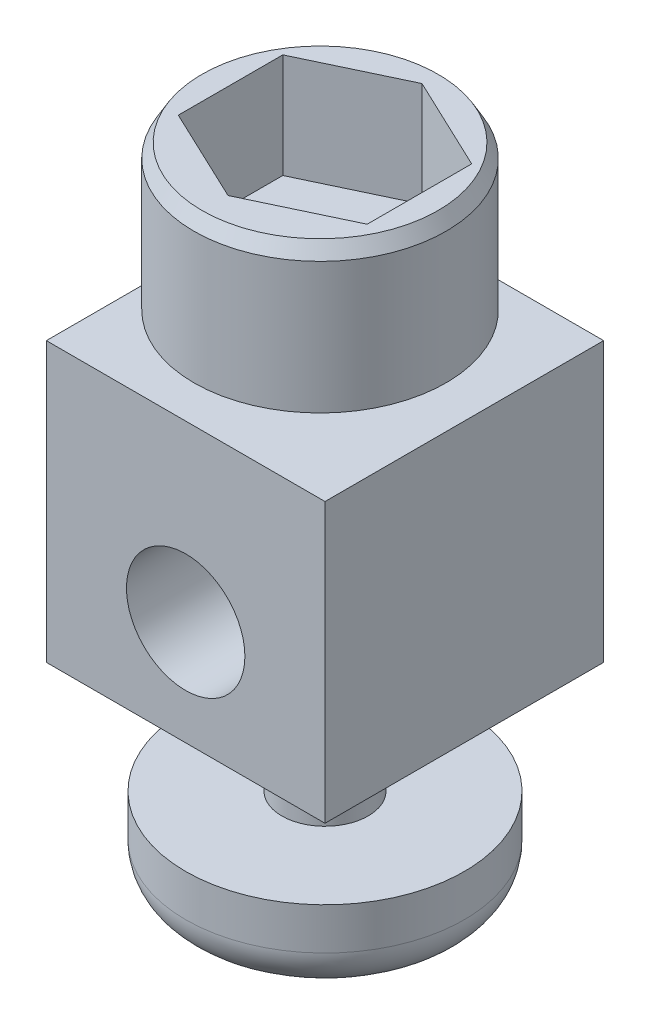
ISO-10303-21;
HEADER;
FILE_DESCRIPTION(('STEP AP214'),'2;1');
FILE_NAME('part.step','',(''),(''),'','','');
FILE_SCHEMA(('AUTOMOTIVE_DESIGN { 1 0 10303 214 1 1 1 1 }'));
ENDSEC;
DATA;
#1=APPLICATION_CONTEXT('core data for automotive mechanical design processes');
#2=APPLICATION_PROTOCOL_DEFINITION('international standard','automotive_design',2000,#1);
#3=PRODUCT_CONTEXT('',#1,'mechanical');
#4=PRODUCT('Part','Part','',(#3));
#5=PRODUCT_RELATED_PRODUCT_CATEGORY('part','',(#4));
#6=PRODUCT_DEFINITION_FORMATION('','',#4);
#7=PRODUCT_DEFINITION_CONTEXT('part definition',#1,'design');
#8=PRODUCT_DEFINITION('design','',#6,#7);
#9=PRODUCT_DEFINITION_SHAPE('','',#8);
#10=(LENGTH_UNIT() NAMED_UNIT(*) SI_UNIT(.MILLI.,.METRE.));
#11=(NAMED_UNIT(*) PLANE_ANGLE_UNIT() SI_UNIT($,.RADIAN.));
#12=(NAMED_UNIT(*) SI_UNIT($,.STERADIAN.) SOLID_ANGLE_UNIT());
#13=UNCERTAINTY_MEASURE_WITH_UNIT(LENGTH_MEASURE(1.E-05),#10,'distance_accuracy_value','');
#14=(GEOMETRIC_REPRESENTATION_CONTEXT(3) GLOBAL_UNCERTAINTY_ASSIGNED_CONTEXT((#13)) GLOBAL_UNIT_ASSIGNED_CONTEXT((#10,
#11,#12)) REPRESENTATION_CONTEXT('',''));
#15=CARTESIAN_POINT('',(0.,0.,0.));
#16=DIRECTION('',(0.,0.,1.));
#17=DIRECTION('',(1.,0.,0.));
#18=AXIS2_PLACEMENT_3D('',#15,#16,#17);
#19=CARTESIAN_POINT('',(0.,-6.5532,2.54));
#20=DIRECTION('',(0.,1.,0.));
#21=DIRECTION('',(-1.,0.,0.));
#22=AXIS2_PLACEMENT_3D('',#19,#20,#21);
#23=CYLINDRICAL_SURFACE('',#22,0.7874);
#24=CARTESIAN_POINT('',(0.,-4.57142455943335,2.54));
#25=DIRECTION('',(0.,1.,0.));
#26=DIRECTION('',(0.,0.,1.));
#27=AXIS2_PLACEMENT_3D('',#24,#25,#26);
#28=CIRCLE('',#27,0.7874);
#29=CARTESIAN_POINT('',(0.,-4.57142455943335,3.3274));
#30=VERTEX_POINT('',#29);
#31=EDGE_CURVE('E39',#30,#30,#28,.T.);
#32=ORIENTED_EDGE('',*,*,#31,.T.);
#33=EDGE_LOOP('',(#32));
#34=FACE_BOUND('',#33,.T.);
#35=CARTESIAN_POINT('',(0.,-2.54,2.54));
#36=DIRECTION('',(0.,1.,0.));
#37=DIRECTION('',(-1.,0.,0.));
#38=AXIS2_PLACEMENT_3D('',#35,#36,#37);
#39=CIRCLE('',#38,0.7874);
#40=CARTESIAN_POINT('',(-0.7874,-2.54,2.54));
#41=VERTEX_POINT('',#40);
#42=EDGE_CURVE('E183',#41,#41,#39,.F.);
#43=ORIENTED_EDGE('',*,*,#42,.T.);
#44=EDGE_LOOP('',(#43));
#45=FACE_BOUND('',#44,.T.);
#46=ADVANCED_FACE('F35',(#34,#45),#23,.T.);
#47=CARTESIAN_POINT('',(0.,5.715,2.63019473081329));
#48=DIRECTION('',(0.,1.,0.));
#49=DIRECTION('',(0.,0.,1.));
#50=AXIS2_PLACEMENT_3D('',#47,#48,#49);
#51=PLANE('',#50);
#52=CARTESIAN_POINT('',(0.,5.715,2.63019473081329));
#53=DIRECTION('',(0.,1.,0.));
#54=DIRECTION('',(0.,0.,1.));
#55=AXIS2_PLACEMENT_3D('',#52,#53,#54);
#56=CIRCLE('',#55,2.15205303162583);
#57=CARTESIAN_POINT('',(0.,5.715,4.78224776243912));
#58=VERTEX_POINT('',#57);
#59=EDGE_CURVE('E192',#58,#58,#56,.T.);
#60=ORIENTED_EDGE('',*,*,#59,.T.);
#61=EDGE_LOOP('',(#60));
#62=FACE_BOUND('',#61,.T.);
#63=DIRECTION('',(-0.00014525916845939,0.,0.999999989449887));
#64=VECTOR('',#63,1.);
#65=CARTESIAN_POINT('',(-1.72148007027149,5.715,1.58779210005618));
#66=LINE('',#65,#64);
#67=CARTESIAN_POINT('',(-1.72148007027149,5.715,1.58779210005618));
#68=VERTEX_POINT('',#67);
#69=CARTESIAN_POINT('',(-1.7217567889874,5.715,3.49279207995818));
#70=VERTEX_POINT('',#69);
#71=EDGE_CURVE('E140',#68,#70,#66,.T.);
#72=ORIENTED_EDGE('',*,*,#71,.F.);
#73=DIRECTION('',(0.90366407888267,0.,-0.428242025655045));
#74=VECTOR('',#73,1.);
#75=CARTESIAN_POINT('',(-1.72148007027149,5.715,1.58779210005618));
#76=LINE('',#75,#74);
#77=CARTESIAN_POINT('',(0.,5.715,0.771991041183319));
#78=VERTEX_POINT('',#77);
#79=EDGE_CURVE('E52',#68,#78,#76,.T.);
#80=ORIENTED_EDGE('',*,*,#79,.T.);
#81=DIRECTION('',(0.903736726890933,0.,0.428088692292221));
#82=VECTOR('',#81,1.);
#83=CARTESIAN_POINT('',(0.,5.715,0.771991041183319));
#84=LINE('',#83,#82);
#85=CARTESIAN_POINT('',(1.72161846472723,5.715,1.5875));
#86=VERTEX_POINT('',#85);
#87=EDGE_CURVE('E144',#78,#86,#84,.T.);
#88=ORIENTED_EDGE('',*,*,#87,.T.);
#89=DIRECTION('',(0.,0.,1.));
#90=VECTOR('',#89,1.);
#91=CARTESIAN_POINT('',(1.72161846472723,5.715,1.5875));
#92=LINE('',#91,#90);
#93=CARTESIAN_POINT('',(1.72161846472723,5.715,3.4925));
#94=VERTEX_POINT('',#93);
#95=EDGE_CURVE('E225',#86,#94,#92,.T.);
#96=ORIENTED_EDGE('',*,*,#95,.T.);
#97=DIRECTION('',(0.903736726890933,0.,-0.428088692292221));
#98=VECTOR('',#97,1.);
#99=CARTESIAN_POINT('',(0.,5.715,4.30800895881668));
#100=LINE('',#99,#98);
#101=CARTESIAN_POINT('',(0.,5.715,4.30800895881668));
#102=VERTEX_POINT('',#101);
#103=EDGE_CURVE('E228',#102,#94,#100,.T.);
#104=ORIENTED_EDGE('',*,*,#103,.F.);
#105=DIRECTION('',(0.903809338051129,0.,0.427935369479527));
#106=VECTOR('',#105,1.);
#107=CARTESIAN_POINT('',(-1.7217567889874,5.715,3.49279207995818));
#108=LINE('',#107,#106);
#109=EDGE_CURVE('E231',#70,#102,#108,.T.);
#110=ORIENTED_EDGE('',*,*,#109,.F.);
#111=EDGE_LOOP('',(#72,#80,#88,#96,#104,#110));
#112=FACE_BOUND('',#111,.T.);
#113=ADVANCED_FACE('F251',(#62,#112),#51,.T.);
#114=CARTESIAN_POINT('',(0.,5.715,2.63019473081329));
#115=DIRECTION('',(0.,-1.,0.));
#116=DIRECTION('',(0.,0.,-1.));
#117=AXIS2_PLACEMENT_3D('',#114,#115,#116);
#118=CYLINDRICAL_SURFACE('',#117,1.3716);
#119=CARTESIAN_POINT('',(0.,2.54,2.63019473081329));
#120=DIRECTION('',(0.,-1.,0.));
#121=DIRECTION('',(0.,0.,-1.));
#122=AXIS2_PLACEMENT_3D('',#119,#120,#121);
#123=CIRCLE('',#122,1.3716);
#124=CARTESIAN_POINT('',(0.,2.54,1.25859473081329));
#125=VERTEX_POINT('',#124);
#126=EDGE_CURVE('E186',#125,#125,#123,.F.);
#127=ORIENTED_EDGE('',*,*,#126,.T.);
#128=EDGE_LOOP('',(#127));
#129=FACE_BOUND('',#128,.T.);
#130=CARTESIAN_POINT('',(0.,2.921,2.63019473081329));
#131=DIRECTION('',(0.,1.,0.));
#132=DIRECTION('',(0.,0.,1.));
#133=AXIS2_PLACEMENT_3D('',#130,#131,#132);
#134=CIRCLE('',#133,1.3716);
#135=CARTESIAN_POINT('',(0.,2.921,4.00179473081329));
#136=VERTEX_POINT('',#135);
#137=EDGE_CURVE('E189',#136,#136,#134,.T.);
#138=ORIENTED_EDGE('',*,*,#137,.F.);
#139=EDGE_LOOP('',(#138));
#140=FACE_BOUND('',#139,.T.);
#141=ADVANCED_FACE('F272',(#129,#140),#118,.T.);
#142=CARTESIAN_POINT('',(2.54,2.54,5.08));
#143=DIRECTION('',(0.,-1.,0.));
#144=DIRECTION('',(0.,0.,-1.));
#145=AXIS2_PLACEMENT_3D('',#142,#143,#144);
#146=PLANE('',#145);
#147=DIRECTION('',(-1.,0.,0.));
#148=VECTOR('',#147,1.);
#149=CARTESIAN_POINT('',(2.54,2.54,0.));
#150=LINE('',#149,#148);
#151=CARTESIAN_POINT('',(2.54,2.54,0.));
#152=VERTEX_POINT('',#151);
#153=CARTESIAN_POINT('',(-2.54,2.54,0.));
#154=VERTEX_POINT('',#153);
#155=EDGE_CURVE('E172',#152,#154,#150,.T.);
#156=ORIENTED_EDGE('',*,*,#155,.T.);
#157=DIRECTION('',(0.,0.,-1.));
#158=VECTOR('',#157,1.);
#159=CARTESIAN_POINT('',(-2.54,2.54,5.08));
#160=LINE('',#159,#158);
#161=CARTESIAN_POINT('',(-2.54,2.54,5.08));
#162=VERTEX_POINT('',#161);
#163=EDGE_CURVE('E176',#162,#154,#160,.T.);
#164=ORIENTED_EDGE('',*,*,#163,.F.);
#165=DIRECTION('',(-1.,0.,0.));
#166=VECTOR('',#165,1.);
#167=CARTESIAN_POINT('',(2.54,2.54,5.08));
#168=LINE('',#167,#166);
#169=CARTESIAN_POINT('',(2.54,2.54,5.08));
#170=VERTEX_POINT('',#169);
#171=EDGE_CURVE('E164',#170,#162,#168,.T.);
#172=ORIENTED_EDGE('',*,*,#171,.F.);
#173=DIRECTION('',(0.,0.,-1.));
#174=VECTOR('',#173,1.);
#175=CARTESIAN_POINT('',(2.54,2.54,5.08));
#176=LINE('',#175,#174);
#177=EDGE_CURVE('E178',#170,#152,#176,.T.);
#178=ORIENTED_EDGE('',*,*,#177,.T.);
#179=EDGE_LOOP('',(#156,#164,#172,#178));
#180=FACE_BOUND('',#179,.T.);
#181=ORIENTED_EDGE('',*,*,#126,.F.);
#182=EDGE_LOOP('',(#181));
#183=FACE_BOUND('',#182,.T.);
#184=ADVANCED_FACE('F295',(#180,#183),#146,.F.);
#185=CARTESIAN_POINT('',(-2.54,-2.54,5.08));
#186=DIRECTION('',(0.,1.,0.));
#187=DIRECTION('',(-1.,0.,0.));
#188=AXIS2_PLACEMENT_3D('',#185,#186,#187);
#189=PLANE('',#188);
#190=DIRECTION('',(1.,0.,0.));
#191=VECTOR('',#190,1.);
#192=CARTESIAN_POINT('',(-2.54,-2.54,0.));
#193=LINE('',#192,#191);
#194=CARTESIAN_POINT('',(-2.54,-2.54,0.));
#195=VERTEX_POINT('',#194);
#196=CARTESIAN_POINT('',(2.54,-2.54,0.));
#197=VERTEX_POINT('',#196);
#198=EDGE_CURVE('E158',#195,#197,#193,.T.);
#199=ORIENTED_EDGE('',*,*,#198,.T.);
#200=DIRECTION('',(0.,0.,-1.));
#201=VECTOR('',#200,1.);
#202=CARTESIAN_POINT('',(2.54,-2.54,5.08));
#203=LINE('',#202,#201);
#204=CARTESIAN_POINT('',(2.54,-2.54,5.08));
#205=VERTEX_POINT('',#204);
#206=EDGE_CURVE('E181',#205,#197,#203,.T.);
#207=ORIENTED_EDGE('',*,*,#206,.F.);
#208=DIRECTION('',(1.,0.,0.));
#209=VECTOR('',#208,1.);
#210=CARTESIAN_POINT('',(-2.54,-2.54,5.08));
#211=LINE('',#210,#209);
#212=CARTESIAN_POINT('',(-2.54,-2.54,5.08));
#213=VERTEX_POINT('',#212);
#214=EDGE_CURVE('E161',#213,#205,#211,.T.);
#215=ORIENTED_EDGE('',*,*,#214,.F.);
#216=DIRECTION('',(0.,0.,-1.));
#217=VECTOR('',#216,1.);
#218=CARTESIAN_POINT('',(-2.54,-2.54,5.08));
#219=LINE('',#218,#217);
#220=EDGE_CURVE('E167',#213,#195,#219,.T.);
#221=ORIENTED_EDGE('',*,*,#220,.T.);
#222=EDGE_LOOP('',(#199,#207,#215,#221));
#223=FACE_BOUND('',#222,.T.);
#224=ORIENTED_EDGE('',*,*,#42,.F.);
#225=EDGE_LOOP('',(#224));
#226=FACE_BOUND('',#225,.T.);
#227=ADVANCED_FACE('F472',(#223,#226),#189,.F.);
#228=CARTESIAN_POINT('',(2.54,-2.54,5.08));
#229=DIRECTION('',(-1.,0.,0.));
#230=DIRECTION('',(0.,-1.,0.));
#231=AXIS2_PLACEMENT_3D('',#228,#229,#230);
#232=PLANE('',#231);
#233=DIRECTION('',(0.,1.,0.));
#234=VECTOR('',#233,1.);
#235=CARTESIAN_POINT('',(2.54,-2.54,0.));
#236=LINE('',#235,#234);
#237=EDGE_CURVE('E170',#197,#152,#236,.T.);
#238=ORIENTED_EDGE('',*,*,#237,.T.);
#239=ORIENTED_EDGE('',*,*,#177,.F.);
#240=DIRECTION('',(0.,1.,0.));
#241=VECTOR('',#240,1.);
#242=CARTESIAN_POINT('',(2.54,-2.54,5.08));
#243=LINE('',#242,#241);
#244=EDGE_CURVE('E90',#205,#170,#243,.T.);
#245=ORIENTED_EDGE('',*,*,#244,.F.);
#246=ORIENTED_EDGE('',*,*,#206,.T.);
#247=EDGE_LOOP('',(#238,#239,#245,#246));
#248=FACE_BOUND('',#247,.T.);
#249=ADVANCED_FACE('F489',(#248),#232,.F.);
#250=CARTESIAN_POINT('',(-2.54,2.54,5.08));
#251=DIRECTION('',(1.,0.,0.));
#252=DIRECTION('',(0.,1.,0.));
#253=AXIS2_PLACEMENT_3D('',#250,#251,#252);
#254=PLANE('',#253);
#255=DIRECTION('',(0.,-1.,0.));
#256=VECTOR('',#255,1.);
#257=CARTESIAN_POINT('',(-2.54,2.54,0.));
#258=LINE('',#257,#256);
#259=EDGE_CURVE('E82',#154,#195,#258,.T.);
#260=ORIENTED_EDGE('',*,*,#259,.T.);
#261=ORIENTED_EDGE('',*,*,#220,.F.);
#262=DIRECTION('',(0.,-1.,0.));
#263=VECTOR('',#262,1.);
#264=CARTESIAN_POINT('',(-2.54,2.54,5.08));
#265=LINE('',#264,#263);
#266=EDGE_CURVE('E61',#162,#213,#265,.T.);
#267=ORIENTED_EDGE('',*,*,#266,.F.);
#268=ORIENTED_EDGE('',*,*,#163,.T.);
#269=EDGE_LOOP('',(#260,#261,#267,#268));
#270=FACE_BOUND('',#269,.T.);
#271=ADVANCED_FACE('F517',(#270),#254,.F.);
#272=CARTESIAN_POINT('',(-2.54,-2.54,5.08));
#273=DIRECTION('',(0.,0.,-1.));
#274=DIRECTION('',(-1.,0.,0.));
#275=AXIS2_PLACEMENT_3D('',#272,#273,#274);
#276=PLANE('',#275);
#277=CARTESIAN_POINT('',(0.,-0.635,5.08));
#278=DIRECTION('',(0.,0.,1.));
#279=DIRECTION('',(1.,0.,0.));
#280=AXIS2_PLACEMENT_3D('',#277,#278,#279);
#281=CIRCLE('',#280,1.0795);
#282=CARTESIAN_POINT('',(1.0795,-0.635,5.08));
#283=VERTEX_POINT('',#282);
#284=EDGE_CURVE('E149',#283,#283,#281,.T.);
#285=ORIENTED_EDGE('',*,*,#284,.F.);
#286=EDGE_LOOP('',(#285));
#287=FACE_BOUND('',#286,.T.);
#288=ORIENTED_EDGE('',*,*,#214,.T.);
#289=ORIENTED_EDGE('',*,*,#244,.T.);
#290=ORIENTED_EDGE('',*,*,#171,.T.);
#291=ORIENTED_EDGE('',*,*,#266,.T.);
#292=EDGE_LOOP('',(#288,#289,#290,#291));
#293=FACE_BOUND('',#292,.T.);
#294=ADVANCED_FACE('F507',(#287,#293),#276,.F.);
#295=CARTESIAN_POINT('',(-2.54,-2.54,0.));
#296=DIRECTION('',(0.,0.,-1.));
#297=DIRECTION('',(-1.,0.,0.));
#298=AXIS2_PLACEMENT_3D('',#295,#296,#297);
#299=PLANE('',#298);
#300=CARTESIAN_POINT('',(0.,-0.635,0.));
#301=DIRECTION('',(0.,0.,1.));
#302=DIRECTION('',(1.,0.,0.));
#303=AXIS2_PLACEMENT_3D('',#300,#301,#302);
#304=CIRCLE('',#303,1.0795);
#305=CARTESIAN_POINT('',(1.0795,-0.635,0.));
#306=VERTEX_POINT('',#305);
#307=EDGE_CURVE('E155',#306,#306,#304,.T.);
#308=ORIENTED_EDGE('',*,*,#307,.T.);
#309=EDGE_LOOP('',(#308));
#310=FACE_BOUND('',#309,.T.);
#311=ORIENTED_EDGE('',*,*,#198,.F.);
#312=ORIENTED_EDGE('',*,*,#259,.F.);
#313=ORIENTED_EDGE('',*,*,#155,.F.);
#314=ORIENTED_EDGE('',*,*,#237,.F.);
#315=EDGE_LOOP('',(#311,#312,#313,#314));
#316=FACE_BOUND('',#315,.T.);
#317=ADVANCED_FACE('F498',(#310,#316),#299,.T.);
#318=CARTESIAN_POINT('',(0.,-0.635,0.));
#319=DIRECTION('',(0.,0.,1.));
#320=DIRECTION('',(1.,0.,0.));
#321=AXIS2_PLACEMENT_3D('',#318,#319,#320);
#322=CYLINDRICAL_SURFACE('',#321,1.0795);
#323=ORIENTED_EDGE('',*,*,#307,.F.);
#324=EDGE_LOOP('',(#323));
#325=FACE_BOUND('',#324,.T.);
#326=ORIENTED_EDGE('',*,*,#284,.T.);
#327=EDGE_LOOP('',(#326));
#328=FACE_BOUND('',#327,.T.);
#329=ADVANCED_FACE('F306',(#325,#328),#322,.F.);
#330=CARTESIAN_POINT('',(0.,2.921,2.63019473081329));
#331=DIRECTION('',(0.,1.,0.));
#332=DIRECTION('',(0.,0.,1.));
#333=AXIS2_PLACEMENT_3D('',#330,#331,#332);
#334=PLANE('',#333);
#335=CARTESIAN_POINT('',(0.,2.921,2.63019473081329));
#336=DIRECTION('',(0.,1.,0.));
#337=DIRECTION('',(0.,0.,1.));
#338=AXIS2_PLACEMENT_3D('',#335,#336,#337);
#339=CIRCLE('',#338,2.0447);
#340=CARTESIAN_POINT('',(0.,2.921,4.67489473081328));
#341=VERTEX_POINT('',#340);
#342=EDGE_CURVE('E11',#341,#341,#339,.F.);
#343=ORIENTED_EDGE('',*,*,#342,.T.);
#344=EDGE_LOOP('',(#343));
#345=FACE_BOUND('',#344,.T.);
#346=ORIENTED_EDGE('',*,*,#137,.T.);
#347=EDGE_LOOP('',(#346));
#348=FACE_BOUND('',#347,.T.);
#349=ADVANCED_FACE('F302',(#345,#348),#334,.F.);
#350=CARTESIAN_POINT('',(0.,2.921,2.63019473081329));
#351=DIRECTION('',(0.,1.,0.));
#352=DIRECTION('',(0.,0.,1.));
#353=AXIS2_PLACEMENT_3D('',#350,#351,#352);
#354=CYLINDRICAL_SURFACE('',#353,2.2987);
#355=CARTESIAN_POINT('',(0.,3.06764696837417,2.63019473081329));
#356=DIRECTION('',(0.,1.,0.));
#357=DIRECTION('',(0.,0.,1.));
#358=AXIS2_PLACEMENT_3D('',#355,#356,#357);
#359=CIRCLE('',#358,2.2987);
#360=CARTESIAN_POINT('',(0.,3.06764696837417,4.92889473081329));
#361=VERTEX_POINT('',#360);
#362=EDGE_CURVE('E44',#361,#361,#359,.T.);
#363=ORIENTED_EDGE('',*,*,#362,.T.);
#364=EDGE_LOOP('',(#363));
#365=FACE_BOUND('',#364,.T.);
#366=CARTESIAN_POINT('',(0.,5.461,2.63019473081329));
#367=DIRECTION('',(0.,1.,0.));
#368=DIRECTION('',(0.,0.,1.));
#369=AXIS2_PLACEMENT_3D('',#366,#367,#368);
#370=CIRCLE('',#369,2.2987);
#371=CARTESIAN_POINT('',(0.,5.461,4.92889473081329));
#372=VERTEX_POINT('',#371);
#373=EDGE_CURVE('E195',#372,#372,#370,.F.);
#374=ORIENTED_EDGE('',*,*,#373,.T.);
#375=EDGE_LOOP('',(#374));
#376=FACE_BOUND('',#375,.T.);
#377=ADVANCED_FACE('F298',(#365,#376),#354,.T.);
#378=CARTESIAN_POINT('',(0.,5.715,2.63019473081329));
#379=DIRECTION('',(0.,-1.,0.));
#380=DIRECTION('',(0.,0.,-1.));
#381=AXIS2_PLACEMENT_3D('',#378,#379,#380);
#382=CONICAL_SURFACE('',#381,2.15205303162583,0.523598775598296);
#383=ORIENTED_EDGE('',*,*,#373,.F.);
#384=EDGE_LOOP('',(#383));
#385=FACE_BOUND('',#384,.T.);
#386=ORIENTED_EDGE('',*,*,#59,.F.);
#387=EDGE_LOOP('',(#386));
#388=FACE_BOUND('',#387,.T.);
#389=ADVANCED_FACE('F301',(#385,#388),#382,.T.);
#390=CARTESIAN_POINT('',(-1.72148007027149,3.81,1.58779210005618));
#391=DIRECTION('',(0.428242025655045,0.,0.90366407888267));
#392=DIRECTION('',(0.90366407888267,0.,-0.428242025655045));
#393=AXIS2_PLACEMENT_3D('',#390,#391,#392);
#394=PLANE('',#393);
#395=ORIENTED_EDGE('',*,*,#79,.F.);
#396=DIRECTION('',(0.,1.,0.));
#397=VECTOR('',#396,1.);
#398=CARTESIAN_POINT('',(-1.72148007027149,3.81,1.58779210005618));
#399=LINE('',#398,#397);
#400=CARTESIAN_POINT('',(-1.72148007027149,3.81,1.58779210005618));
#401=VERTEX_POINT('',#400);
#402=EDGE_CURVE('E139',#401,#68,#399,.T.);
#403=ORIENTED_EDGE('',*,*,#402,.F.);
#404=DIRECTION('',(0.90366407888267,0.,-0.428242025655045));
#405=VECTOR('',#404,1.);
#406=CARTESIAN_POINT('',(-1.72148007027149,3.81,1.58779210005618));
#407=LINE('',#406,#405);
#408=CARTESIAN_POINT('',(0.,3.81,0.771991041183319));
#409=VERTEX_POINT('',#408);
#410=EDGE_CURVE('E129',#401,#409,#407,.T.);
#411=ORIENTED_EDGE('',*,*,#410,.T.);
#412=DIRECTION('',(0.,1.,0.));
#413=VECTOR('',#412,1.);
#414=CARTESIAN_POINT('',(0.,3.81,0.771991041183319));
#415=LINE('',#414,#413);
#416=EDGE_CURVE('E138',#409,#78,#415,.T.);
#417=ORIENTED_EDGE('',*,*,#416,.T.);
#418=EDGE_LOOP('',(#395,#403,#411,#417));
#419=FACE_BOUND('',#418,.T.);
#420=ADVANCED_FACE('F137',(#419),#394,.T.);
#421=CARTESIAN_POINT('',(0.,3.81,0.771991041183319));
#422=DIRECTION('',(-0.428088692292221,0.,0.903736726890933));
#423=DIRECTION('',(0.903736726890933,0.,0.428088692292221));
#424=AXIS2_PLACEMENT_3D('',#421,#422,#423);
#425=PLANE('',#424);
#426=ORIENTED_EDGE('',*,*,#87,.F.);
#427=ORIENTED_EDGE('',*,*,#416,.F.);
#428=DIRECTION('',(0.903736726890933,0.,0.428088692292221));
#429=VECTOR('',#428,1.);
#430=CARTESIAN_POINT('',(0.,3.81,0.771991041183319));
#431=LINE('',#430,#429);
#432=CARTESIAN_POINT('',(1.72161846472723,3.81,1.5875));
#433=VERTEX_POINT('',#432);
#434=EDGE_CURVE('E125',#409,#433,#431,.T.);
#435=ORIENTED_EDGE('',*,*,#434,.T.);
#436=DIRECTION('',(0.,1.,0.));
#437=VECTOR('',#436,1.);
#438=CARTESIAN_POINT('',(1.72161846472723,3.81,1.5875));
#439=LINE('',#438,#437);
#440=EDGE_CURVE('E146',#433,#86,#439,.T.);
#441=ORIENTED_EDGE('',*,*,#440,.T.);
#442=EDGE_LOOP('',(#426,#427,#435,#441));
#443=FACE_BOUND('',#442,.T.);
#444=ADVANCED_FACE('F142',(#443),#425,.T.);
#445=CARTESIAN_POINT('',(1.72161846472723,3.81,1.5875));
#446=DIRECTION('',(-1.,0.,0.));
#447=DIRECTION('',(0.,0.,1.));
#448=AXIS2_PLACEMENT_3D('',#445,#446,#447);
#449=PLANE('',#448);
#450=ORIENTED_EDGE('',*,*,#95,.F.);
#451=ORIENTED_EDGE('',*,*,#440,.F.);
#452=DIRECTION('',(0.,0.,1.));
#453=VECTOR('',#452,1.);
#454=CARTESIAN_POINT('',(1.72161846472723,3.81,1.5875));
#455=LINE('',#454,#453);
#456=CARTESIAN_POINT('',(1.72161846472723,3.81,3.4925));
#457=VERTEX_POINT('',#456);
#458=EDGE_CURVE('E132',#433,#457,#455,.T.);
#459=ORIENTED_EDGE('',*,*,#458,.T.);
#460=DIRECTION('',(0.,1.,0.));
#461=VECTOR('',#460,1.);
#462=CARTESIAN_POINT('',(1.72161846472723,3.81,3.4925));
#463=LINE('',#462,#461);
#464=EDGE_CURVE('E151',#457,#94,#463,.T.);
#465=ORIENTED_EDGE('',*,*,#464,.T.);
#466=EDGE_LOOP('',(#450,#451,#459,#465));
#467=FACE_BOUND('',#466,.T.);
#468=ADVANCED_FACE('F243',(#467),#449,.T.);
#469=CARTESIAN_POINT('',(0.,3.81,4.30800895881668));
#470=DIRECTION('',(0.428088692292221,0.,0.903736726890933));
#471=DIRECTION('',(0.903736726890933,0.,-0.428088692292221));
#472=AXIS2_PLACEMENT_3D('',#469,#470,#471);
#473=PLANE('',#472);
#474=ORIENTED_EDGE('',*,*,#103,.T.);
#475=ORIENTED_EDGE('',*,*,#464,.F.);
#476=DIRECTION('',(0.903736726890933,0.,-0.428088692292221));
#477=VECTOR('',#476,1.);
#478=CARTESIAN_POINT('',(0.,3.81,4.30800895881668));
#479=LINE('',#478,#477);
#480=CARTESIAN_POINT('',(0.,3.81,4.30800895881668));
#481=VERTEX_POINT('',#480);
#482=EDGE_CURVE('E216',#481,#457,#479,.T.);
#483=ORIENTED_EDGE('',*,*,#482,.F.);
#484=DIRECTION('',(0.,1.,0.));
#485=VECTOR('',#484,1.);
#486=CARTESIAN_POINT('',(0.,3.81,4.30800895881668));
#487=LINE('',#486,#485);
#488=EDGE_CURVE('E239',#481,#102,#487,.T.);
#489=ORIENTED_EDGE('',*,*,#488,.T.);
#490=EDGE_LOOP('',(#474,#475,#483,#489));
#491=FACE_BOUND('',#490,.T.);
#492=ADVANCED_FACE('F247',(#491),#473,.F.);
#493=CARTESIAN_POINT('',(-1.7217567889874,3.81,3.49279207995818));
#494=DIRECTION('',(-0.427935369479527,0.,0.903809338051129));
#495=DIRECTION('',(0.903809338051129,0.,0.427935369479527));
#496=AXIS2_PLACEMENT_3D('',#493,#494,#495);
#497=PLANE('',#496);
#498=ORIENTED_EDGE('',*,*,#109,.T.);
#499=ORIENTED_EDGE('',*,*,#488,.F.);
#500=DIRECTION('',(0.903809338051129,0.,0.427935369479527));
#501=VECTOR('',#500,1.);
#502=CARTESIAN_POINT('',(-1.7217567889874,3.81,3.49279207995818));
#503=LINE('',#502,#501);
#504=CARTESIAN_POINT('',(-1.7217567889874,3.81,3.49279207995818));
#505=VERTEX_POINT('',#504);
#506=EDGE_CURVE('E218',#505,#481,#503,.T.);
#507=ORIENTED_EDGE('',*,*,#506,.F.);
#508=DIRECTION('',(0.,1.,0.));
#509=VECTOR('',#508,1.);
#510=CARTESIAN_POINT('',(-1.7217567889874,3.81,3.49279207995818));
#511=LINE('',#510,#509);
#512=EDGE_CURVE('E237',#505,#70,#511,.T.);
#513=ORIENTED_EDGE('',*,*,#512,.T.);
#514=EDGE_LOOP('',(#498,#499,#507,#513));
#515=FACE_BOUND('',#514,.T.);
#516=ADVANCED_FACE('F256',(#515),#497,.F.);
#517=CARTESIAN_POINT('',(-1.72148007027149,3.81,1.58779210005618));
#518=DIRECTION('',(-0.999999989449887,0.,-0.00014525916845939));
#519=DIRECTION('',(-0.00014525916845939,0.,0.999999989449887));
#520=AXIS2_PLACEMENT_3D('',#517,#518,#519);
#521=PLANE('',#520);
#522=ORIENTED_EDGE('',*,*,#71,.T.);
#523=ORIENTED_EDGE('',*,*,#512,.F.);
#524=DIRECTION('',(-0.00014525916845939,0.,0.999999989449887));
#525=VECTOR('',#524,1.);
#526=CARTESIAN_POINT('',(-1.72148007027149,3.81,1.58779210005618));
#527=LINE('',#526,#525);
#528=EDGE_CURVE('E221',#401,#505,#527,.T.);
#529=ORIENTED_EDGE('',*,*,#528,.F.);
#530=ORIENTED_EDGE('',*,*,#402,.T.);
#531=EDGE_LOOP('',(#522,#523,#529,#530));
#532=FACE_BOUND('',#531,.T.);
#533=ADVANCED_FACE('F253',(#532),#521,.F.);
#534=CARTESIAN_POINT('',(1.72161846472723,3.81,-0.0438756021511246));
#535=DIRECTION('',(0.,-1.,0.));
#536=DIRECTION('',(0.,0.,-1.));
#537=AXIS2_PLACEMENT_3D('',#534,#535,#536);
#538=PLANE('',#537);
#539=ORIENTED_EDGE('',*,*,#410,.F.);
#540=ORIENTED_EDGE('',*,*,#528,.T.);
#541=ORIENTED_EDGE('',*,*,#506,.T.);
#542=ORIENTED_EDGE('',*,*,#482,.T.);
#543=ORIENTED_EDGE('',*,*,#458,.F.);
#544=ORIENTED_EDGE('',*,*,#434,.F.);
#545=EDGE_LOOP('',(#539,#540,#541,#542,#543,#544));
#546=FACE_BOUND('',#545,.T.);
#547=ADVANCED_FACE('F127',(#546),#538,.F.);
#548=CARTESIAN_POINT('',(0.,3.06764696837417,2.63019473081329));
#549=DIRECTION('',(0.,1.,0.));
#550=DIRECTION('',(0.,0.,1.));
#551=AXIS2_PLACEMENT_3D('',#548,#549,#550);
#552=CONICAL_SURFACE('',#551,2.2987,1.0471975511966);
#553=ORIENTED_EDGE('',*,*,#342,.F.);
#554=EDGE_LOOP('',(#553));
#555=FACE_BOUND('',#554,.T.);
#556=ORIENTED_EDGE('',*,*,#362,.F.);
#557=EDGE_LOOP('',(#556));
#558=FACE_BOUND('',#557,.T.);
#559=ADVANCED_FACE('F37',(#555,#558),#552,.T.);
#560=CARTESIAN_POINT('',(0.,-4.57142455943335,2.54));
#561=DIRECTION('',(0.,1.,0.));
#562=DIRECTION('',(0.,0.,1.));
#563=AXIS2_PLACEMENT_3D('',#560,#561,#562);
#564=PLANE('',#563);
#565=CARTESIAN_POINT('',(0.,-4.57142455943335,2.54));
#566=DIRECTION('',(0.,1.,0.));
#567=DIRECTION('',(0.,0.,1.));
#568=AXIS2_PLACEMENT_3D('',#565,#566,#567);
#569=CIRCLE('',#568,2.54);
#570=CARTESIAN_POINT('',(0.,-4.57142455943335,5.08));
#571=VERTEX_POINT('',#570);
#572=EDGE_CURVE('E201',#571,#571,#569,.T.);
#573=ORIENTED_EDGE('',*,*,#572,.T.);
#574=EDGE_LOOP('',(#573));
#575=FACE_BOUND('',#574,.T.);
#576=ORIENTED_EDGE('',*,*,#31,.F.);
#577=EDGE_LOOP('',(#576));
#578=FACE_BOUND('',#577,.T.);
#579=ADVANCED_FACE('F352',(#575,#578),#564,.T.);
#580=CARTESIAN_POINT('',(0.,-6.09542455943348,2.54));
#581=DIRECTION('',(0.,-1.,0.));
#582=DIRECTION('',(0.,0.,-1.));
#583=AXIS2_PLACEMENT_3D('',#580,#581,#582);
#584=PLANE('',#583);
#585=CARTESIAN_POINT('',(0.,-6.09542455943348,2.54));
#586=DIRECTION('',(0.,1.,0.));
#587=DIRECTION('',(0.,0.,1.));
#588=AXIS2_PLACEMENT_3D('',#585,#586,#587);
#589=CIRCLE('',#588,1.778);
#590=CARTESIAN_POINT('',(0.,-6.09542455943348,4.318));
#591=VERTEX_POINT('',#590);
#592=EDGE_CURVE('E211',#591,#591,#589,.T.);
#593=ORIENTED_EDGE('',*,*,#592,.F.);
#594=EDGE_LOOP('',(#593));
#595=FACE_BOUND('',#594,.T.);
#596=CARTESIAN_POINT('',(0.,-6.09542455943348,2.54));
#597=DIRECTION('',(0.,-1.,0.));
#598=DIRECTION('',(0.,0.,-1.));
#599=AXIS2_PLACEMENT_3D('',#596,#597,#598);
#600=CIRCLE('',#599,0.7874);
#601=CARTESIAN_POINT('',(0.,-6.09542455943348,1.7526));
#602=VERTEX_POINT('',#601);
#603=EDGE_CURVE('E199',#602,#602,#600,.T.);
#604=ORIENTED_EDGE('',*,*,#603,.F.);
#605=EDGE_LOOP('',(#604));
#606=FACE_BOUND('',#605,.T.);
#607=ADVANCED_FACE('F385',(#595,#606),#584,.T.);
#608=CARTESIAN_POINT('',(0.,-4.57142455943335,2.54));
#609=DIRECTION('',(0.,1.,0.));
#610=DIRECTION('',(0.,0.,1.));
#611=AXIS2_PLACEMENT_3D('',#608,#609,#610);
#612=CYLINDRICAL_SURFACE('',#611,2.54);
#613=CARTESIAN_POINT('',(0.,-5.33342455943348,2.54));
#614=DIRECTION('',(0.,1.,0.));
#615=DIRECTION('',(0.,0.,1.));
#616=AXIS2_PLACEMENT_3D('',#613,#614,#615);
#617=CIRCLE('',#616,2.54);
#618=CARTESIAN_POINT('',(0.,-5.33342455943348,5.08));
#619=VERTEX_POINT('',#618);
#620=EDGE_CURVE('E206',#619,#619,#617,.T.);
#621=ORIENTED_EDGE('',*,*,#620,.T.);
#622=EDGE_LOOP('',(#621));
#623=FACE_BOUND('',#622,.T.);
#624=ORIENTED_EDGE('',*,*,#572,.F.);
#625=EDGE_LOOP('',(#624));
#626=FACE_BOUND('',#625,.T.);
#627=ADVANCED_FACE('F290',(#623,#626),#612,.T.);
#628=CARTESIAN_POINT('',(0.,-5.33342455943348,2.54));
#629=DIRECTION('',(0.,1.,0.));
#630=DIRECTION('',(0.,0.,1.));
#631=AXIS2_PLACEMENT_3D('',#628,#629,#630);
#632=TOROIDAL_SURFACE('',#631,1.778,0.762);
#633=ORIENTED_EDGE('',*,*,#592,.T.);
#634=EDGE_LOOP('',(#633));
#635=FACE_BOUND('',#634,.T.);
#636=ORIENTED_EDGE('',*,*,#620,.F.);
#637=EDGE_LOOP('',(#636));
#638=FACE_BOUND('',#637,.T.);
#639=ADVANCED_FACE('F283',(#635,#638),#632,.T.);
#640=CARTESIAN_POINT('',(0.,-6.5532,2.54));
#641=DIRECTION('',(0.,-1.,0.));
#642=DIRECTION('',(1.,0.,0.));
#643=AXIS2_PLACEMENT_3D('',#640,#641,#642);
#644=PLANE('',#643);
#645=CARTESIAN_POINT('',(0.,-6.5532,2.54));
#646=DIRECTION('',(0.,-1.,0.));
#647=DIRECTION('',(1.,0.,0.));
#648=AXIS2_PLACEMENT_3D('',#645,#646,#647);
#649=CIRCLE('',#648,0.7874);
#650=CARTESIAN_POINT('',(0.787400000000001,-6.5532,2.54));
#651=VERTEX_POINT('',#650);
#652=EDGE_CURVE('E145',#651,#651,#649,.T.);
#653=ORIENTED_EDGE('',*,*,#652,.T.);
#654=EDGE_LOOP('',(#653));
#655=FACE_BOUND('',#654,.T.);
#656=ADVANCED_FACE('F279',(#655),#644,.T.);
#657=ORIENTED_EDGE('',*,*,#603,.T.);
#658=EDGE_LOOP('',(#657));
#659=FACE_BOUND('',#658,.T.);
#660=ORIENTED_EDGE('',*,*,#652,.F.);
#661=EDGE_LOOP('',(#660));
#662=FACE_BOUND('',#661,.T.);
#663=ADVANCED_FACE('F268',(#659,#662),#23,.T.);
#664=CLOSED_SHELL('',(#46,#113,#141,#184,#227,#249,#271,#294,#317,#329,#349,#377,#389,#420,#444,
#468,#492,#516,#533,#547,#559,#579,#607,#627,#639,#656,#663));
#665=MANIFOLD_SOLID_BREP('B2',#664);
#666=ADVANCED_BREP_SHAPE_REPRESENTATION('',(#18,#665),#14);
#667=SHAPE_DEFINITION_REPRESENTATION(#9,#666);
ENDSEC;
END-ISO-10303-21;
